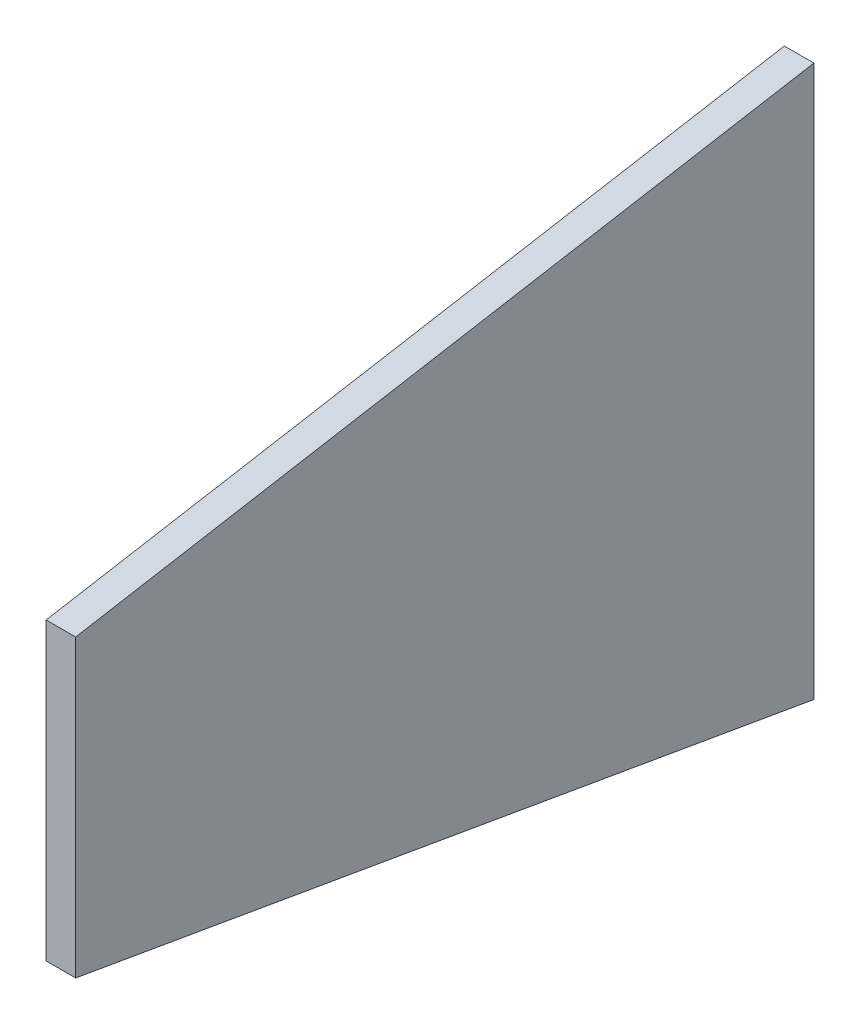
ISO-10303-21;
HEADER;
FILE_DESCRIPTION(('STEP AP214'),'2;1');
FILE_NAME('part.step','',(''),(''),'','','');
FILE_SCHEMA(('AUTOMOTIVE_DESIGN { 1 0 10303 214 1 1 1 1 }'));
ENDSEC;
DATA;
#1=APPLICATION_CONTEXT('core data for automotive mechanical design processes');
#2=APPLICATION_PROTOCOL_DEFINITION('international standard','automotive_design',2000,#1);
#3=PRODUCT_CONTEXT('',#1,'mechanical');
#4=PRODUCT('Part','Part','',(#3));
#5=PRODUCT_RELATED_PRODUCT_CATEGORY('part','',(#4));
#6=PRODUCT_DEFINITION_FORMATION('','',#4);
#7=PRODUCT_DEFINITION_CONTEXT('part definition',#1,'design');
#8=PRODUCT_DEFINITION('design','',#6,#7);
#9=PRODUCT_DEFINITION_SHAPE('','',#8);
#10=(LENGTH_UNIT() NAMED_UNIT(*) SI_UNIT(.MILLI.,.METRE.));
#11=(NAMED_UNIT(*) PLANE_ANGLE_UNIT() SI_UNIT($,.RADIAN.));
#12=(NAMED_UNIT(*) SI_UNIT($,.STERADIAN.) SOLID_ANGLE_UNIT());
#13=UNCERTAINTY_MEASURE_WITH_UNIT(LENGTH_MEASURE(1.E-05),#10,'distance_accuracy_value','');
#14=(GEOMETRIC_REPRESENTATION_CONTEXT(3) GLOBAL_UNCERTAINTY_ASSIGNED_CONTEXT((#13)) GLOBAL_UNIT_ASSIGNED_CONTEXT((#10,
#11,#12)) REPRESENTATION_CONTEXT('',''));
#15=CARTESIAN_POINT('',(0.,0.,0.));
#16=DIRECTION('',(0.,0.,1.));
#17=DIRECTION('',(1.,0.,0.));
#18=AXIS2_PLACEMENT_3D('',#15,#16,#17);
#19=CARTESIAN_POINT('',(3.,13.,75.));
#20=DIRECTION('',(0.,0.985308020399641,-0.170786723535938));
#21=DIRECTION('',(0.,0.170786723535938,0.985308020399641));
#22=AXIS2_PLACEMENT_3D('',#19,#20,#21);
#23=PLANE('',#22);
#24=DIRECTION('',(0.,-0.170786723535938,-0.985308020399641));
#25=VECTOR('',#24,1.);
#26=CARTESIAN_POINT('',(0.,13.,75.));
#27=LINE('',#26,#25);
#28=CARTESIAN_POINT('',(0.,13.,75.));
#29=VERTEX_POINT('',#28);
#30=CARTESIAN_POINT('',(0.,0.,0.));
#31=VERTEX_POINT('',#30);
#32=EDGE_CURVE('E113',#29,#31,#27,.T.);
#33=ORIENTED_EDGE('',*,*,#32,.T.);
#34=DIRECTION('',(-1.,0.,0.));
#35=VECTOR('',#34,1.);
#36=CARTESIAN_POINT('',(3.,0.,0.));
#37=LINE('',#36,#35);
#38=CARTESIAN_POINT('',(3.,0.,0.));
#39=VERTEX_POINT('',#38);
#40=EDGE_CURVE('E11',#39,#31,#37,.T.);
#41=ORIENTED_EDGE('',*,*,#40,.F.);
#42=DIRECTION('',(0.,-0.170786723535938,-0.985308020399641));
#43=VECTOR('',#42,1.);
#44=CARTESIAN_POINT('',(3.,13.,75.));
#45=LINE('',#44,#43);
#46=CARTESIAN_POINT('',(3.,13.,75.));
#47=VERTEX_POINT('',#46);
#48=EDGE_CURVE('E97',#47,#39,#45,.T.);
#49=ORIENTED_EDGE('',*,*,#48,.F.);
#50=DIRECTION('',(-1.,0.,0.));
#51=VECTOR('',#50,1.);
#52=CARTESIAN_POINT('',(3.,13.,75.));
#53=LINE('',#52,#51);
#54=EDGE_CURVE('E109',#47,#29,#53,.T.);
#55=ORIENTED_EDGE('',*,*,#54,.T.);
#56=EDGE_LOOP('',(#33,#41,#49,#55));
#57=FACE_BOUND('',#56,.T.);
#58=ADVANCED_FACE('F45',(#57),#23,.F.);
#59=CARTESIAN_POINT('',(3.,0.,0.));
#60=DIRECTION('',(0.,0.,1.));
#61=DIRECTION('',(1.,0.,0.));
#62=AXIS2_PLACEMENT_3D('',#59,#60,#61);
#63=PLANE('',#62);
#64=DIRECTION('',(0.,1.,0.));
#65=VECTOR('',#64,1.);
#66=CARTESIAN_POINT('',(0.,0.,0.));
#67=LINE('',#66,#65);
#68=CARTESIAN_POINT('',(0.,56.,0.));
#69=VERTEX_POINT('',#68);
#70=EDGE_CURVE('E102',#31,#69,#67,.T.);
#71=ORIENTED_EDGE('',*,*,#70,.T.);
#72=DIRECTION('',(-1.,0.,0.));
#73=VECTOR('',#72,1.);
#74=CARTESIAN_POINT('',(3.,56.,0.));
#75=LINE('',#74,#73);
#76=CARTESIAN_POINT('',(3.,56.,0.));
#77=VERTEX_POINT('',#76);
#78=EDGE_CURVE('E54',#77,#69,#75,.T.);
#79=ORIENTED_EDGE('',*,*,#78,.F.);
#80=DIRECTION('',(0.,1.,0.));
#81=VECTOR('',#80,1.);
#82=CARTESIAN_POINT('',(3.,0.,0.));
#83=LINE('',#82,#81);
#84=EDGE_CURVE('E92',#39,#77,#83,.T.);
#85=ORIENTED_EDGE('',*,*,#84,.F.);
#86=ORIENTED_EDGE('',*,*,#40,.T.);
#87=EDGE_LOOP('',(#71,#79,#85,#86));
#88=FACE_BOUND('',#87,.T.);
#89=ADVANCED_FACE('F101',(#88),#63,.F.);
#90=CARTESIAN_POINT('',(3.,56.,0.));
#91=DIRECTION('',(0.,-0.985308020399641,-0.170786723535938));
#92=DIRECTION('',(0.,0.170786723535938,-0.985308020399641));
#93=AXIS2_PLACEMENT_3D('',#90,#91,#92);
#94=PLANE('',#93);
#95=DIRECTION('',(0.,-0.170786723535938,0.985308020399641));
#96=VECTOR('',#95,1.);
#97=CARTESIAN_POINT('',(0.,56.,0.));
#98=LINE('',#97,#96);
#99=CARTESIAN_POINT('',(0.,43.,75.));
#100=VERTEX_POINT('',#99);
#101=EDGE_CURVE('E79',#69,#100,#98,.T.);
#102=ORIENTED_EDGE('',*,*,#101,.T.);
#103=DIRECTION('',(-1.,0.,0.));
#104=VECTOR('',#103,1.);
#105=CARTESIAN_POINT('',(3.,43.,75.));
#106=LINE('',#105,#104);
#107=CARTESIAN_POINT('',(3.,43.,75.));
#108=VERTEX_POINT('',#107);
#109=EDGE_CURVE('E104',#108,#100,#106,.T.);
#110=ORIENTED_EDGE('',*,*,#109,.F.);
#111=DIRECTION('',(0.,-0.170786723535938,0.985308020399641));
#112=VECTOR('',#111,1.);
#113=CARTESIAN_POINT('',(3.,56.,0.));
#114=LINE('',#113,#112);
#115=EDGE_CURVE('E95',#77,#108,#114,.T.);
#116=ORIENTED_EDGE('',*,*,#115,.F.);
#117=ORIENTED_EDGE('',*,*,#78,.T.);
#118=EDGE_LOOP('',(#102,#110,#116,#117));
#119=FACE_BOUND('',#118,.T.);
#120=ADVANCED_FACE('F105',(#119),#94,.F.);
#121=CARTESIAN_POINT('',(3.,43.,75.));
#122=DIRECTION('',(0.,0.,-1.));
#123=DIRECTION('',(-1.,0.,0.));
#124=AXIS2_PLACEMENT_3D('',#121,#122,#123);
#125=PLANE('',#124);
#126=DIRECTION('',(0.,-1.,0.));
#127=VECTOR('',#126,1.);
#128=CARTESIAN_POINT('',(0.,43.,75.));
#129=LINE('',#128,#127);
#130=EDGE_CURVE('E85',#100,#29,#129,.T.);
#131=ORIENTED_EDGE('',*,*,#130,.T.);
#132=ORIENTED_EDGE('',*,*,#54,.F.);
#133=DIRECTION('',(0.,-1.,0.));
#134=VECTOR('',#133,1.);
#135=CARTESIAN_POINT('',(3.,43.,75.));
#136=LINE('',#135,#134);
#137=EDGE_CURVE('E62',#108,#47,#136,.T.);
#138=ORIENTED_EDGE('',*,*,#137,.F.);
#139=ORIENTED_EDGE('',*,*,#109,.T.);
#140=EDGE_LOOP('',(#131,#132,#138,#139));
#141=FACE_BOUND('',#140,.T.);
#142=ADVANCED_FACE('F126',(#141),#125,.F.);
#143=CARTESIAN_POINT('',(3.,0.,0.));
#144=DIRECTION('',(1.,0.,0.));
#145=DIRECTION('',(0.,0.,-1.));
#146=AXIS2_PLACEMENT_3D('',#143,#144,#145);
#147=PLANE('',#146);
#148=ORIENTED_EDGE('',*,*,#48,.T.);
#149=ORIENTED_EDGE('',*,*,#84,.T.);
#150=ORIENTED_EDGE('',*,*,#115,.T.);
#151=ORIENTED_EDGE('',*,*,#137,.T.);
#152=EDGE_LOOP('',(#148,#149,#150,#151));
#153=FACE_BOUND('',#152,.T.);
#154=ADVANCED_FACE('F93',(#153),#147,.T.);
#155=CARTESIAN_POINT('',(0.,0.,0.));
#156=DIRECTION('',(1.,0.,0.));
#157=DIRECTION('',(0.,0.,-1.));
#158=AXIS2_PLACEMENT_3D('',#155,#156,#157);
#159=PLANE('',#158);
#160=ORIENTED_EDGE('',*,*,#32,.F.);
#161=ORIENTED_EDGE('',*,*,#130,.F.);
#162=ORIENTED_EDGE('',*,*,#101,.F.);
#163=ORIENTED_EDGE('',*,*,#70,.F.);
#164=EDGE_LOOP('',(#160,#161,#162,#163));
#165=FACE_BOUND('',#164,.T.);
#166=ADVANCED_FACE('F129',(#165),#159,.F.);
#167=CLOSED_SHELL('',(#58,#89,#120,#142,#154,#166));
#168=MANIFOLD_SOLID_BREP('B2',#167);
#169=ADVANCED_BREP_SHAPE_REPRESENTATION('',(#18,#168),#14);
#170=SHAPE_DEFINITION_REPRESENTATION(#9,#169);
ENDSEC;
END-ISO-10303-21;
